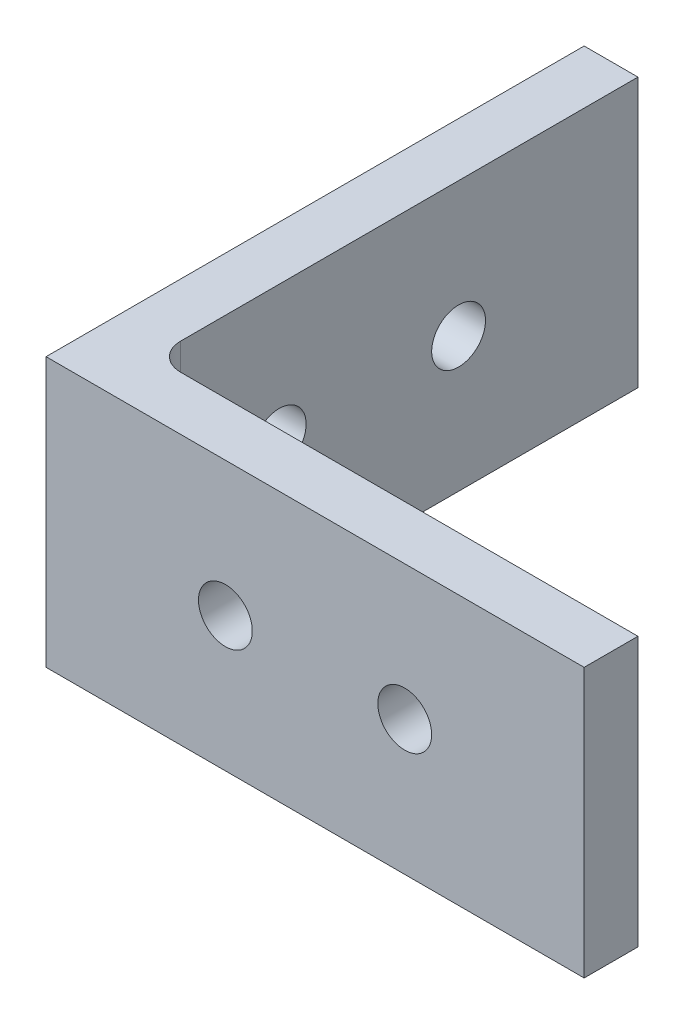
ISO-10303-21;
HEADER;
FILE_DESCRIPTION(('STEP AP214'),'2;1');
FILE_NAME('part.step','',(''),(''),'','','');
FILE_SCHEMA(('AUTOMOTIVE_DESIGN { 1 0 10303 214 1 1 1 1 }'));
ENDSEC;
DATA;
#1=APPLICATION_CONTEXT('core data for automotive mechanical design processes');
#2=APPLICATION_PROTOCOL_DEFINITION('international standard','automotive_design',2000,#1);
#3=PRODUCT_CONTEXT('',#1,'mechanical');
#4=PRODUCT('Part','Part','',(#3));
#5=PRODUCT_RELATED_PRODUCT_CATEGORY('part','',(#4));
#6=PRODUCT_DEFINITION_FORMATION('','',#4);
#7=PRODUCT_DEFINITION_CONTEXT('part definition',#1,'design');
#8=PRODUCT_DEFINITION('design','',#6,#7);
#9=PRODUCT_DEFINITION_SHAPE('','',#8);
#10=(LENGTH_UNIT() NAMED_UNIT(*) SI_UNIT(.MILLI.,.METRE.));
#11=(NAMED_UNIT(*) PLANE_ANGLE_UNIT() SI_UNIT($,.RADIAN.));
#12=(NAMED_UNIT(*) SI_UNIT($,.STERADIAN.) SOLID_ANGLE_UNIT());
#13=UNCERTAINTY_MEASURE_WITH_UNIT(LENGTH_MEASURE(1.E-05),#10,'distance_accuracy_value','');
#14=(GEOMETRIC_REPRESENTATION_CONTEXT(3) GLOBAL_UNCERTAINTY_ASSIGNED_CONTEXT((#13)) GLOBAL_UNIT_ASSIGNED_CONTEXT((#10,
#11,#12)) REPRESENTATION_CONTEXT('',''));
#15=CARTESIAN_POINT('',(0.,0.,0.));
#16=DIRECTION('',(0.,0.,1.));
#17=DIRECTION('',(1.,0.,0.));
#18=AXIS2_PLACEMENT_3D('',#15,#16,#17);
#19=CARTESIAN_POINT('',(100.,25.,0.));
#20=DIRECTION('',(0.,0.,-1.));
#21=DIRECTION('',(-1.,0.,0.));
#22=AXIS2_PLACEMENT_3D('',#19,#20,#21);
#23=PLANE('',#22);
#24=CARTESIAN_POINT('',(33.33,0.,0.));
#25=DIRECTION('',(0.,0.,-1.));
#26=DIRECTION('',(-1.,0.,0.));
#27=AXIS2_PLACEMENT_3D('',#24,#25,#26);
#28=CIRCLE('',#27,5.);
#29=CARTESIAN_POINT('',(28.33,0.,0.));
#30=VERTEX_POINT('',#29);
#31=EDGE_CURVE('E185',#30,#30,#28,.T.);
#32=ORIENTED_EDGE('',*,*,#31,.T.);
#33=EDGE_LOOP('',(#32));
#34=FACE_BOUND('',#33,.T.);
#35=CARTESIAN_POINT('',(66.66,0.,0.));
#36=DIRECTION('',(0.,0.,-1.));
#37=DIRECTION('',(-1.,0.,0.));
#38=AXIS2_PLACEMENT_3D('',#35,#36,#37);
#39=CIRCLE('',#38,5.);
#40=CARTESIAN_POINT('',(61.66,0.,0.));
#41=VERTEX_POINT('',#40);
#42=EDGE_CURVE('E196',#41,#41,#39,.T.);
#43=ORIENTED_EDGE('',*,*,#42,.T.);
#44=EDGE_LOOP('',(#43));
#45=FACE_BOUND('',#44,.T.);
#46=DIRECTION('',(1.,0.,0.));
#47=VECTOR('',#46,1.);
#48=CARTESIAN_POINT('',(100.,-25.,0.));
#49=LINE('',#48,#47);
#50=CARTESIAN_POINT('',(0.,-25.,0.));
#51=VERTEX_POINT('',#50);
#52=CARTESIAN_POINT('',(100.,-25.,0.));
#53=VERTEX_POINT('',#52);
#54=EDGE_CURVE('E129',#51,#53,#49,.T.);
#55=ORIENTED_EDGE('',*,*,#54,.T.);
#56=DIRECTION('',(0.,-1.,0.));
#57=VECTOR('',#56,1.);
#58=CARTESIAN_POINT('',(100.,25.,0.));
#59=LINE('',#58,#57);
#60=CARTESIAN_POINT('',(100.,25.,0.));
#61=VERTEX_POINT('',#60);
#62=EDGE_CURVE('E109',#61,#53,#59,.T.);
#63=ORIENTED_EDGE('',*,*,#62,.F.);
#64=DIRECTION('',(1.,0.,0.));
#65=VECTOR('',#64,1.);
#66=CARTESIAN_POINT('',(100.,25.,0.));
#67=LINE('',#66,#65);
#68=CARTESIAN_POINT('',(0.,25.,0.));
#69=VERTEX_POINT('',#68);
#70=EDGE_CURVE('E116',#69,#61,#67,.T.);
#71=ORIENTED_EDGE('',*,*,#70,.F.);
#72=DIRECTION('',(0.,-1.,0.));
#73=VECTOR('',#72,1.);
#74=CARTESIAN_POINT('',(0.,25.,0.));
#75=LINE('',#74,#73);
#76=EDGE_CURVE('E150',#69,#51,#75,.T.);
#77=ORIENTED_EDGE('',*,*,#76,.T.);
#78=EDGE_LOOP('',(#55,#63,#71,#77));
#79=FACE_BOUND('',#78,.T.);
#80=ADVANCED_FACE('F45',(#34,#45,#79),#23,.F.);
#81=CARTESIAN_POINT('',(100.,25.,-10.));
#82=DIRECTION('',(-1.,0.,0.));
#83=DIRECTION('',(0.,0.,1.));
#84=AXIS2_PLACEMENT_3D('',#81,#82,#83);
#85=PLANE('',#84);
#86=DIRECTION('',(0.,0.,-1.));
#87=VECTOR('',#86,1.);
#88=CARTESIAN_POINT('',(100.,-25.,-10.));
#89=LINE('',#88,#87);
#90=CARTESIAN_POINT('',(100.,-25.,-10.));
#91=VERTEX_POINT('',#90);
#92=EDGE_CURVE('E164',#53,#91,#89,.T.);
#93=ORIENTED_EDGE('',*,*,#92,.T.);
#94=DIRECTION('',(0.,-1.,0.));
#95=VECTOR('',#94,1.);
#96=CARTESIAN_POINT('',(100.,25.,-10.));
#97=LINE('',#96,#95);
#98=CARTESIAN_POINT('',(100.,25.,-10.));
#99=VERTEX_POINT('',#98);
#100=EDGE_CURVE('E112',#99,#91,#97,.T.);
#101=ORIENTED_EDGE('',*,*,#100,.F.);
#102=DIRECTION('',(0.,0.,-1.));
#103=VECTOR('',#102,1.);
#104=CARTESIAN_POINT('',(100.,25.,-10.));
#105=LINE('',#104,#103);
#106=EDGE_CURVE('E105',#61,#99,#105,.T.);
#107=ORIENTED_EDGE('',*,*,#106,.F.);
#108=ORIENTED_EDGE('',*,*,#62,.T.);
#109=EDGE_LOOP('',(#93,#101,#107,#108));
#110=FACE_BOUND('',#109,.T.);
#111=ADVANCED_FACE('F107',(#110),#85,.F.);
#112=CARTESIAN_POINT('',(10.,25.,-10.));
#113=DIRECTION('',(0.,0.,1.));
#114=DIRECTION('',(1.,0.,0.));
#115=AXIS2_PLACEMENT_3D('',#112,#113,#114);
#116=PLANE('',#115);
#117=CARTESIAN_POINT('',(33.33,0.,-10.));
#118=DIRECTION('',(0.,0.,-1.));
#119=DIRECTION('',(-1.,0.,0.));
#120=AXIS2_PLACEMENT_3D('',#117,#118,#119);
#121=CIRCLE('',#120,5.);
#122=CARTESIAN_POINT('',(28.33,0.,-10.));
#123=VERTEX_POINT('',#122);
#124=EDGE_CURVE('E204',#123,#123,#121,.T.);
#125=ORIENTED_EDGE('',*,*,#124,.F.);
#126=EDGE_LOOP('',(#125));
#127=FACE_BOUND('',#126,.T.);
#128=CARTESIAN_POINT('',(66.66,0.,-10.));
#129=DIRECTION('',(0.,0.,-1.));
#130=DIRECTION('',(-1.,0.,0.));
#131=AXIS2_PLACEMENT_3D('',#128,#129,#130);
#132=CIRCLE('',#131,5.);
#133=CARTESIAN_POINT('',(61.66,0.,-10.));
#134=VERTEX_POINT('',#133);
#135=EDGE_CURVE('E200',#134,#134,#132,.T.);
#136=ORIENTED_EDGE('',*,*,#135,.F.);
#137=EDGE_LOOP('',(#136));
#138=FACE_BOUND('',#137,.T.);
#139=DIRECTION('',(-1.,0.,0.));
#140=VECTOR('',#139,1.);
#141=CARTESIAN_POINT('',(10.,-25.,-10.));
#142=LINE('',#141,#140);
#143=CARTESIAN_POINT('',(15.,-25.,-10.));
#144=VERTEX_POINT('',#143);
#145=EDGE_CURVE('E161',#91,#144,#142,.T.);
#146=ORIENTED_EDGE('',*,*,#145,.T.);
#147=DIRECTION('',(0.,-1.,0.));
#148=VECTOR('',#147,1.);
#149=CARTESIAN_POINT('',(15.,25.,-10.));
#150=LINE('',#149,#148);
#151=CARTESIAN_POINT('',(15.,25.,-10.));
#152=VERTEX_POINT('',#151);
#153=EDGE_CURVE('E61',#144,#152,#150,.F.);
#154=ORIENTED_EDGE('',*,*,#153,.T.);
#155=DIRECTION('',(-1.,0.,0.));
#156=VECTOR('',#155,1.);
#157=CARTESIAN_POINT('',(10.,25.,-10.));
#158=LINE('',#157,#156);
#159=EDGE_CURVE('E115',#99,#152,#158,.T.);
#160=ORIENTED_EDGE('',*,*,#159,.F.);
#161=ORIENTED_EDGE('',*,*,#100,.T.);
#162=EDGE_LOOP('',(#146,#154,#160,#161));
#163=FACE_BOUND('',#162,.T.);
#164=ADVANCED_FACE('F221',(#127,#138,#163),#116,.F.);
#165=CARTESIAN_POINT('',(10.,25.,-100.));
#166=DIRECTION('',(-1.,0.,0.));
#167=DIRECTION('',(0.,0.,1.));
#168=AXIS2_PLACEMENT_3D('',#165,#166,#167);
#169=PLANE('',#168);
#170=CARTESIAN_POINT('',(10.,0.,-33.333));
#171=DIRECTION('',(1.,0.,0.));
#172=DIRECTION('',(0.,0.,-1.));
#173=AXIS2_PLACEMENT_3D('',#170,#171,#172);
#174=CIRCLE('',#173,5.);
#175=CARTESIAN_POINT('',(10.,0.,-38.333));
#176=VERTEX_POINT('',#175);
#177=EDGE_CURVE('E189',#176,#176,#174,.T.);
#178=ORIENTED_EDGE('',*,*,#177,.F.);
#179=EDGE_LOOP('',(#178));
#180=FACE_BOUND('',#179,.T.);
#181=CARTESIAN_POINT('',(10.,0.,-66.666));
#182=DIRECTION('',(1.,0.,0.));
#183=DIRECTION('',(0.,0.,-1.));
#184=AXIS2_PLACEMENT_3D('',#181,#182,#183);
#185=CIRCLE('',#184,5.);
#186=CARTESIAN_POINT('',(10.,0.,-71.666));
#187=VERTEX_POINT('',#186);
#188=EDGE_CURVE('E184',#187,#187,#185,.T.);
#189=ORIENTED_EDGE('',*,*,#188,.F.);
#190=EDGE_LOOP('',(#189));
#191=FACE_BOUND('',#190,.T.);
#192=DIRECTION('',(0.,0.,-1.));
#193=VECTOR('',#192,1.);
#194=CARTESIAN_POINT('',(10.,25.,-100.));
#195=LINE('',#194,#193);
#196=CARTESIAN_POINT('',(10.,25.,-15.));
#197=VERTEX_POINT('',#196);
#198=CARTESIAN_POINT('',(10.,25.,-100.));
#199=VERTEX_POINT('',#198);
#200=EDGE_CURVE('E175',#197,#199,#195,.T.);
#201=ORIENTED_EDGE('',*,*,#200,.F.);
#202=DIRECTION('',(0.,-1.,0.));
#203=VECTOR('',#202,1.);
#204=CARTESIAN_POINT('',(10.,-25.,-15.));
#205=LINE('',#204,#203);
#206=CARTESIAN_POINT('',(10.,-25.,-15.));
#207=VERTEX_POINT('',#206);
#208=EDGE_CURVE('E131',#197,#207,#205,.T.);
#209=ORIENTED_EDGE('',*,*,#208,.T.);
#210=DIRECTION('',(0.,0.,-1.));
#211=VECTOR('',#210,1.);
#212=CARTESIAN_POINT('',(10.,-25.,-100.));
#213=LINE('',#212,#211);
#214=CARTESIAN_POINT('',(10.,-25.,-100.));
#215=VERTEX_POINT('',#214);
#216=EDGE_CURVE('E158',#207,#215,#213,.T.);
#217=ORIENTED_EDGE('',*,*,#216,.T.);
#218=DIRECTION('',(0.,-1.,0.));
#219=VECTOR('',#218,1.);
#220=CARTESIAN_POINT('',(10.,25.,-100.));
#221=LINE('',#220,#219);
#222=EDGE_CURVE('E137',#199,#215,#221,.T.);
#223=ORIENTED_EDGE('',*,*,#222,.F.);
#224=EDGE_LOOP('',(#201,#209,#217,#223));
#225=FACE_BOUND('',#224,.T.);
#226=ADVANCED_FACE('F224',(#180,#191,#225),#169,.F.);
#227=CARTESIAN_POINT('',(0.,25.,-100.));
#228=DIRECTION('',(0.,0.,1.));
#229=DIRECTION('',(1.,0.,0.));
#230=AXIS2_PLACEMENT_3D('',#227,#228,#229);
#231=PLANE('',#230);
#232=DIRECTION('',(-1.,0.,0.));
#233=VECTOR('',#232,1.);
#234=CARTESIAN_POINT('',(0.,-25.,-100.));
#235=LINE('',#234,#233);
#236=CARTESIAN_POINT('',(0.,-25.,-100.));
#237=VERTEX_POINT('',#236);
#238=EDGE_CURVE('E155',#215,#237,#235,.T.);
#239=ORIENTED_EDGE('',*,*,#238,.T.);
#240=DIRECTION('',(0.,-1.,0.));
#241=VECTOR('',#240,1.);
#242=CARTESIAN_POINT('',(0.,25.,-100.));
#243=LINE('',#242,#241);
#244=CARTESIAN_POINT('',(0.,25.,-100.));
#245=VERTEX_POINT('',#244);
#246=EDGE_CURVE('E146',#245,#237,#243,.T.);
#247=ORIENTED_EDGE('',*,*,#246,.F.);
#248=DIRECTION('',(-1.,0.,0.));
#249=VECTOR('',#248,1.);
#250=CARTESIAN_POINT('',(0.,25.,-100.));
#251=LINE('',#250,#249);
#252=EDGE_CURVE('E172',#199,#245,#251,.T.);
#253=ORIENTED_EDGE('',*,*,#252,.F.);
#254=ORIENTED_EDGE('',*,*,#222,.T.);
#255=EDGE_LOOP('',(#239,#247,#253,#254));
#256=FACE_BOUND('',#255,.T.);
#257=ADVANCED_FACE('F237',(#256),#231,.F.);
#258=CARTESIAN_POINT('',(0.,25.,0.));
#259=DIRECTION('',(1.,0.,0.));
#260=DIRECTION('',(0.,0.,-1.));
#261=AXIS2_PLACEMENT_3D('',#258,#259,#260);
#262=PLANE('',#261);
#263=CARTESIAN_POINT('',(0.,0.,-33.333));
#264=DIRECTION('',(1.,0.,0.));
#265=DIRECTION('',(0.,0.,-1.));
#266=AXIS2_PLACEMENT_3D('',#263,#264,#265);
#267=CIRCLE('',#266,5.);
#268=CARTESIAN_POINT('',(0.,0.,-38.333));
#269=VERTEX_POINT('',#268);
#270=EDGE_CURVE('E169',#269,#269,#267,.T.);
#271=ORIENTED_EDGE('',*,*,#270,.T.);
#272=EDGE_LOOP('',(#271));
#273=FACE_BOUND('',#272,.T.);
#274=CARTESIAN_POINT('',(0.,0.,-66.666));
#275=DIRECTION('',(1.,0.,0.));
#276=DIRECTION('',(0.,0.,-1.));
#277=AXIS2_PLACEMENT_3D('',#274,#275,#276);
#278=CIRCLE('',#277,5.);
#279=CARTESIAN_POINT('',(0.,0.,-71.666));
#280=VERTEX_POINT('',#279);
#281=EDGE_CURVE('E180',#280,#280,#278,.T.);
#282=ORIENTED_EDGE('',*,*,#281,.T.);
#283=EDGE_LOOP('',(#282));
#284=FACE_BOUND('',#283,.T.);
#285=DIRECTION('',(0.,0.,1.));
#286=VECTOR('',#285,1.);
#287=CARTESIAN_POINT('',(0.,-25.,0.));
#288=LINE('',#287,#286);
#289=EDGE_CURVE('E126',#237,#51,#288,.T.);
#290=ORIENTED_EDGE('',*,*,#289,.T.);
#291=ORIENTED_EDGE('',*,*,#76,.F.);
#292=DIRECTION('',(0.,0.,1.));
#293=VECTOR('',#292,1.);
#294=CARTESIAN_POINT('',(0.,25.,0.));
#295=LINE('',#294,#293);
#296=EDGE_CURVE('E121',#245,#69,#295,.T.);
#297=ORIENTED_EDGE('',*,*,#296,.F.);
#298=ORIENTED_EDGE('',*,*,#246,.T.);
#299=EDGE_LOOP('',(#290,#291,#297,#298));
#300=FACE_BOUND('',#299,.T.);
#301=ADVANCED_FACE('F240',(#273,#284,#300),#262,.F.);
#302=CARTESIAN_POINT('',(0.,25.,0.));
#303=DIRECTION('',(0.,-1.,0.));
#304=DIRECTION('',(0.,0.,-1.));
#305=AXIS2_PLACEMENT_3D('',#302,#303,#304);
#306=PLANE('',#305);
#307=ORIENTED_EDGE('',*,*,#70,.T.);
#308=ORIENTED_EDGE('',*,*,#106,.T.);
#309=ORIENTED_EDGE('',*,*,#159,.T.);
#310=CARTESIAN_POINT('',(15.,25.,-15.));
#311=DIRECTION('',(0.,-1.,0.));
#312=DIRECTION('',(0.,0.,-1.));
#313=AXIS2_PLACEMENT_3D('',#310,#311,#312);
#314=CIRCLE('',#313,5.);
#315=EDGE_CURVE('E11',#152,#197,#314,.T.);
#316=ORIENTED_EDGE('',*,*,#315,.T.);
#317=ORIENTED_EDGE('',*,*,#200,.T.);
#318=ORIENTED_EDGE('',*,*,#252,.T.);
#319=ORIENTED_EDGE('',*,*,#296,.T.);
#320=EDGE_LOOP('',(#307,#308,#309,#316,#317,#318,#319));
#321=FACE_BOUND('',#320,.T.);
#322=ADVANCED_FACE('F119',(#321),#306,.F.);
#323=CARTESIAN_POINT('',(0.,-25.,0.));
#324=DIRECTION('',(0.,-1.,0.));
#325=DIRECTION('',(0.,0.,-1.));
#326=AXIS2_PLACEMENT_3D('',#323,#324,#325);
#327=PLANE('',#326);
#328=ORIENTED_EDGE('',*,*,#54,.F.);
#329=ORIENTED_EDGE('',*,*,#289,.F.);
#330=ORIENTED_EDGE('',*,*,#238,.F.);
#331=ORIENTED_EDGE('',*,*,#216,.F.);
#332=CARTESIAN_POINT('',(15.,-25.,-15.));
#333=DIRECTION('',(0.,-1.,0.));
#334=DIRECTION('',(0.,0.,-1.));
#335=AXIS2_PLACEMENT_3D('',#332,#333,#334);
#336=CIRCLE('',#335,5.);
#337=EDGE_CURVE('E54',#207,#144,#336,.F.);
#338=ORIENTED_EDGE('',*,*,#337,.T.);
#339=ORIENTED_EDGE('',*,*,#145,.F.);
#340=ORIENTED_EDGE('',*,*,#92,.F.);
#341=EDGE_LOOP('',(#328,#329,#330,#331,#338,#339,#340));
#342=FACE_BOUND('',#341,.T.);
#343=ADVANCED_FACE('F241',(#342),#327,.T.);
#344=CARTESIAN_POINT('',(15.,25.,-15.));
#345=DIRECTION('',(0.,1.,0.));
#346=DIRECTION('',(0.,0.,1.));
#347=AXIS2_PLACEMENT_3D('',#344,#345,#346);
#348=CYLINDRICAL_SURFACE('',#347,5.);
#349=ORIENTED_EDGE('',*,*,#315,.F.);
#350=ORIENTED_EDGE('',*,*,#153,.F.);
#351=ORIENTED_EDGE('',*,*,#337,.F.);
#352=ORIENTED_EDGE('',*,*,#208,.F.);
#353=EDGE_LOOP('',(#349,#350,#351,#352));
#354=FACE_BOUND('',#353,.T.);
#355=ADVANCED_FACE('F47',(#354),#348,.F.);
#356=CARTESIAN_POINT('',(0.,0.,-66.666));
#357=DIRECTION('',(1.,0.,0.));
#358=DIRECTION('',(0.,0.,-1.));
#359=AXIS2_PLACEMENT_3D('',#356,#357,#358);
#360=CYLINDRICAL_SURFACE('',#359,5.);
#361=ORIENTED_EDGE('',*,*,#281,.F.);
#362=EDGE_LOOP('',(#361));
#363=FACE_BOUND('',#362,.T.);
#364=ORIENTED_EDGE('',*,*,#188,.T.);
#365=EDGE_LOOP('',(#364));
#366=FACE_BOUND('',#365,.T.);
#367=ADVANCED_FACE('F248',(#363,#366),#360,.F.);
#368=CARTESIAN_POINT('',(0.,0.,-33.333));
#369=DIRECTION('',(1.,0.,0.));
#370=DIRECTION('',(0.,0.,-1.));
#371=AXIS2_PLACEMENT_3D('',#368,#369,#370);
#372=CYLINDRICAL_SURFACE('',#371,5.);
#373=ORIENTED_EDGE('',*,*,#270,.F.);
#374=EDGE_LOOP('',(#373));
#375=FACE_BOUND('',#374,.T.);
#376=ORIENTED_EDGE('',*,*,#177,.T.);
#377=EDGE_LOOP('',(#376));
#378=FACE_BOUND('',#377,.T.);
#379=ADVANCED_FACE('F272',(#375,#378),#372,.F.);
#380=CARTESIAN_POINT('',(66.66,0.,0.));
#381=DIRECTION('',(0.,0.,-1.));
#382=DIRECTION('',(-1.,0.,0.));
#383=AXIS2_PLACEMENT_3D('',#380,#381,#382);
#384=CYLINDRICAL_SURFACE('',#383,5.);
#385=ORIENTED_EDGE('',*,*,#42,.F.);
#386=EDGE_LOOP('',(#385));
#387=FACE_BOUND('',#386,.T.);
#388=ORIENTED_EDGE('',*,*,#135,.T.);
#389=EDGE_LOOP('',(#388));
#390=FACE_BOUND('',#389,.T.);
#391=ADVANCED_FACE('F217',(#387,#390),#384,.F.);
#392=CARTESIAN_POINT('',(33.33,0.,0.));
#393=DIRECTION('',(0.,0.,-1.));
#394=DIRECTION('',(-1.,0.,0.));
#395=AXIS2_PLACEMENT_3D('',#392,#393,#394);
#396=CYLINDRICAL_SURFACE('',#395,5.);
#397=ORIENTED_EDGE('',*,*,#31,.F.);
#398=EDGE_LOOP('',(#397));
#399=FACE_BOUND('',#398,.T.);
#400=ORIENTED_EDGE('',*,*,#124,.T.);
#401=EDGE_LOOP('',(#400));
#402=FACE_BOUND('',#401,.T.);
#403=ADVANCED_FACE('F214',(#399,#402),#396,.F.);
#404=CLOSED_SHELL('',(#80,#111,#164,#226,#257,#301,#322,#343,#355,#367,#379,#391,#403));
#405=MANIFOLD_SOLID_BREP('B2',#404);
#406=ADVANCED_BREP_SHAPE_REPRESENTATION('',(#18,#405),#14);
#407=SHAPE_DEFINITION_REPRESENTATION(#9,#406);
ENDSEC;
END-ISO-10303-21;
